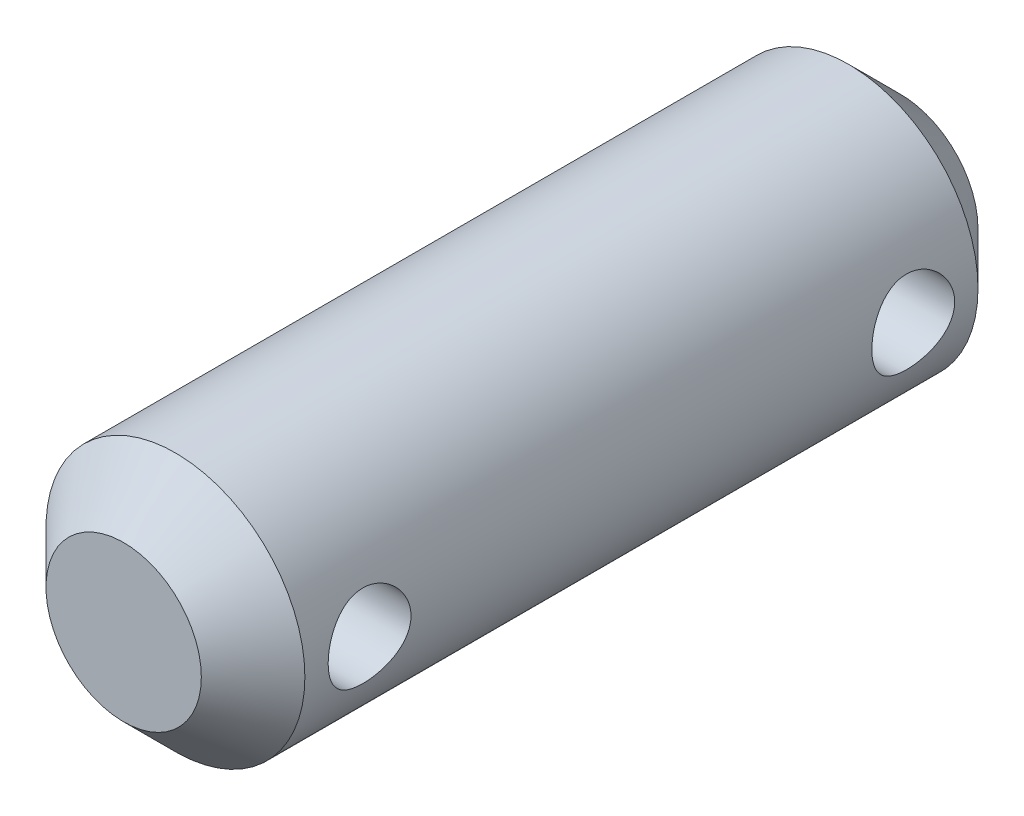
ISO-10303-21;
HEADER;
FILE_DESCRIPTION(('STEP AP214'),'2;1');
FILE_NAME('part.step','',(''),(''),'','','');
FILE_SCHEMA(('AUTOMOTIVE_DESIGN { 1 0 10303 214 1 1 1 1 }'));
ENDSEC;
DATA;
#1=APPLICATION_CONTEXT('core data for automotive mechanical design processes');
#2=APPLICATION_PROTOCOL_DEFINITION('international standard','automotive_design',2000,#1);
#3=PRODUCT_CONTEXT('',#1,'mechanical');
#4=PRODUCT('Part','Part','',(#3));
#5=PRODUCT_RELATED_PRODUCT_CATEGORY('part','',(#4));
#6=PRODUCT_DEFINITION_FORMATION('','',#4);
#7=PRODUCT_DEFINITION_CONTEXT('part definition',#1,'design');
#8=PRODUCT_DEFINITION('design','',#6,#7);
#9=PRODUCT_DEFINITION_SHAPE('','',#8);
#10=(LENGTH_UNIT() NAMED_UNIT(*) SI_UNIT(.MILLI.,.METRE.));
#11=(NAMED_UNIT(*) PLANE_ANGLE_UNIT() SI_UNIT($,.RADIAN.));
#12=(NAMED_UNIT(*) SI_UNIT($,.STERADIAN.) SOLID_ANGLE_UNIT());
#13=UNCERTAINTY_MEASURE_WITH_UNIT(LENGTH_MEASURE(1.E-05),#10,'distance_accuracy_value','');
#14=(GEOMETRIC_REPRESENTATION_CONTEXT(3) GLOBAL_UNCERTAINTY_ASSIGNED_CONTEXT((#13)) GLOBAL_UNIT_ASSIGNED_CONTEXT((#10,
#11,#12)) REPRESENTATION_CONTEXT('',''));
#15=CARTESIAN_POINT('',(0.,0.,0.));
#16=DIRECTION('',(0.,0.,1.));
#17=DIRECTION('',(1.,0.,0.));
#18=AXIS2_PLACEMENT_3D('',#15,#16,#17);
#19=CARTESIAN_POINT('',(0.,0.,30.));
#20=DIRECTION('',(0.,0.,-1.));
#21=DIRECTION('',(-1.,0.,0.));
#22=AXIS2_PLACEMENT_3D('',#19,#20,#21);
#23=CYLINDRICAL_SURFACE('',#22,5.);
#24=CARTESIAN_POINT('',(-5.,0.,6.1));
#25=CARTESIAN_POINT('',(-4.99999978543627,-0.0874958063159797,6.09999975634942));
#26=CARTESIAN_POINT('',(-4.99768184156355,-0.174994637059061,6.09279940472075));
#27=CARTESIAN_POINT('',(-4.98866262172227,-0.347426901237482,6.06426818047074));
#28=CARTESIAN_POINT('',(-4.98196054553558,-0.432359863373708,6.04293472818209));
#29=CARTESIAN_POINT('',(-4.96490383635409,-0.597149225791564,5.98693507878823));
#30=CARTESIAN_POINT('',(-4.95455502045191,-0.677013473384594,5.9522901076294));
#31=CARTESIAN_POINT('',(-4.93126901642872,-0.829798762851157,5.87074316991274));
#32=CARTESIAN_POINT('',(-4.91833138300386,-0.902718607024945,5.82383909423439));
#33=CARTESIAN_POINT('',(-4.89077067933825,-1.04189475779498,5.71751588649597));
#34=CARTESIAN_POINT('',(-4.87610957732918,-1.1078960922464,5.65777290104658));
#35=CARTESIAN_POINT('',(-4.8469706570307,-1.22913423693228,5.52815693345259));
#36=CARTESIAN_POINT('',(-4.83249287552328,-1.28436891793797,5.45828195234513));
#37=CARTESIAN_POINT('',(-4.80494810799029,-1.38391395073831,5.30814714548961));
#38=CARTESIAN_POINT('',(-4.79192785635417,-1.42790123109944,5.22766371872946));
#39=CARTESIAN_POINT('',(-4.76934657798645,-1.5016091713459,5.05995765622989));
#40=CARTESIAN_POINT('',(-4.75978458968016,-1.53133379773326,4.9727369020117));
#41=CARTESIAN_POINT('',(-4.74560122760597,-1.57473134311321,4.79691739272712));
#42=CARTESIAN_POINT('',(-4.74083414932744,-1.58887896846386,4.70844789824797));
#43=CARTESIAN_POINT('',(-4.73634831045,-1.60220433058851,4.53027240081555));
#44=CARTESIAN_POINT('',(-4.73662813227306,-1.6013862709372,4.44056675214803));
#45=CARTESIAN_POINT('',(-4.74207619100075,-1.58517380736381,4.26643441511176));
#46=CARTESIAN_POINT('',(-4.7470401743042,-1.57038842132725,4.1819435465553));
#47=CARTESIAN_POINT('',(-4.76096457446162,-1.52765058974139,4.01671115557794));
#48=CARTESIAN_POINT('',(-4.76992543490025,-1.49969668269327,3.9359700504148));
#49=CARTESIAN_POINT('',(-4.7909865416364,-1.43099645158812,3.77910214117426));
#50=CARTESIAN_POINT('',(-4.80313229469362,-1.39006273103723,3.70306378004853));
#51=CARTESIAN_POINT('',(-4.82917444861168,-1.29669494334068,3.55873795697324));
#52=CARTESIAN_POINT('',(-4.8430713221454,-1.24425776827155,3.49045259725646));
#53=CARTESIAN_POINT('',(-4.87186372141871,-1.12640551540387,3.36013532713372));
#54=CARTESIAN_POINT('',(-4.8867752080818,-1.06048936249403,3.29855922306119));
#55=CARTESIAN_POINT('',(-4.91533168114877,-0.919081432217151,3.18722132176635));
#56=CARTESIAN_POINT('',(-4.92897656433707,-0.843588875652696,3.13746048685711));
#57=CARTESIAN_POINT('',(-4.95361789744584,-0.684261580712376,3.05083655671978));
#58=CARTESIAN_POINT('',(-4.96459080547942,-0.600361279440637,3.01408689916357));
#59=CARTESIAN_POINT('',(-4.98248161100196,-0.427135850361132,2.95536040333729));
#60=CARTESIAN_POINT('',(-4.98940080204637,-0.33781246313155,2.93337885218328));
#61=CARTESIAN_POINT('',(-4.99819424239134,-0.16014178958932,2.90559993333479));
#62=CARTESIAN_POINT('',(-5.00026060178154,-0.0719002860170756,2.8991859263889));
#63=CARTESIAN_POINT('',(-4.99968655318444,0.104410269588104,2.9009792182213));
#64=CARTESIAN_POINT('',(-4.99704687004206,0.192479346087438,2.90918426530988));
#65=CARTESIAN_POINT('',(-4.98748380317497,0.363535018203811,2.93949011308117));
#66=CARTESIAN_POINT('',(-4.98067486649266,0.446594362478022,2.9612199100859));
#67=CARTESIAN_POINT('',(-4.96357585995348,0.607861654600581,3.01750179939625));
#68=CARTESIAN_POINT('',(-4.95328535439546,0.686068993794123,3.05205549660218));
#69=CARTESIAN_POINT('',(-4.92995531019905,0.837596923870444,3.13397101717815));
#70=CARTESIAN_POINT('',(-4.9168532627009,0.910745620500965,3.1816325119423));
#71=CARTESIAN_POINT('',(-4.8893940824048,1.04821150300662,3.28805387298564));
#72=CARTESIAN_POINT('',(-4.87503659432078,1.11252617555398,3.3468168864583));
#73=CARTESIAN_POINT('',(-4.84592967283237,1.23328321488635,3.47667415961096));
#74=CARTESIAN_POINT('',(-4.83118884166735,1.2892857947562,3.54818026768848));
#75=CARTESIAN_POINT('',(-4.80360443110145,1.38854141992569,3.69989467445821));
#76=CARTESIAN_POINT('',(-4.79076083607138,1.43179457025641,3.78010290145405));
#77=CARTESIAN_POINT('',(-4.76856262886575,1.50407580301231,3.94684357865608));
#78=CARTESIAN_POINT('',(-4.75919656820051,1.53315066307446,4.03335413498969));
#79=CARTESIAN_POINT('',(-4.74511281699328,1.57620668246201,4.21040720981033));
#80=CARTESIAN_POINT('',(-4.74039324536734,1.59019395006567,4.30094808113599));
#81=CARTESIAN_POINT('',(-4.73633927898768,1.60222535311566,4.47887596916399));
#82=CARTESIAN_POINT('',(-4.73676019091382,1.60099388446006,4.56620901132899));
#83=CARTESIAN_POINT('',(-4.74234159093745,1.5843835514937,4.7393570054347));
#84=CARTESIAN_POINT('',(-4.74750183734632,1.56900540861121,4.82517203456103));
#85=CARTESIAN_POINT('',(-4.76180543144416,1.52503332416461,4.99148342537688));
#86=CARTESIAN_POINT('',(-4.77088327236763,1.49665627942706,5.07204319889287));
#87=CARTESIAN_POINT('',(-4.79197975594362,1.42766427484382,5.22732176040081));
#88=CARTESIAN_POINT('',(-4.8039990169992,1.38704674114626,5.3020393157627));
#89=CARTESIAN_POINT('',(-4.83023494368376,1.29279266707432,5.44680962981441));
#90=CARTESIAN_POINT('',(-4.8445211905268,1.23869308431578,5.51654826273404));
#91=CARTESIAN_POINT('',(-4.87337180847353,1.11981399792884,5.64619174582096));
#92=CARTESIAN_POINT('',(-4.88793625446695,1.05503158166823,5.70609390519865));
#93=CARTESIAN_POINT('',(-4.91631108200117,0.913912210298352,5.81645828592383));
#94=CARTESIAN_POINT('',(-4.93007751880385,0.837251351760781,5.8665189518843));
#95=CARTESIAN_POINT('',(-4.9547378769786,0.676163529926938,5.95298018809723));
#96=CARTESIAN_POINT('',(-4.96563279071293,0.591739263208158,5.98938547932079));
#97=CARTESIAN_POINT('',(-4.98268341064065,0.423663431644845,6.04524777983044));
#98=CARTESIAN_POINT('',(-4.9891190130145,0.340376766487331,6.06571845058311));
#99=CARTESIAN_POINT('',(-4.99777693541394,0.17139400107612,6.09309314290401));
#100=CARTESIAN_POINT('',(-5.00000021015613,0.0856984512613952,6.10000023864547));
#101=CARTESIAN_POINT('',(-5.,0.,6.1));
#102=B_SPLINE_CURVE_WITH_KNOTS('',3,(#24,#25,#26,#27,#28,#29,#30,#31,#32,#33,#34,#35,#36,#37,
#38,#39,#40,#41,#42,#43,#44,#45,#46,#47,#48,#49,#50,#51,#52,#53,#54,#55,#56,#57,#58,#59,#60,#61,
#62,#63,#64,#65,#66,#67,#68,#69,#70,#71,#72,#73,#74,#75,#76,#77,#78,#79,#80,#81,#82,#83,#84,#85,
#86,#87,#88,#89,#90,#91,#92,#93,#94,#95,#96,#97,#98,#99,#100,#101),.UNSPECIFIED.,.T.,.F.,(4,2,2,
2,2,2,2,2,2,2,2,2,2,2,2,2,2,2,2,2,2,2,2,2,2,2,2,2,2,2,2,2,2,2,2,2,2,2,4),(0.,0.262172289866487,
0.524392446348364,0.786196202111711,1.04804502964703,1.31749718151567,1.58700256668426,
1.86354828826627,2.14001705671955,2.40780489999506,2.67551752794223,2.93207089351445,
3.18865273918778,3.44912195934763,3.70966163813009,3.98267284808623,4.25570628624555,
4.53106471334194,4.80633522466348,5.07051010591344,5.33464430132699,5.59183416387789,
5.84905622438333,6.11273355055081,6.37648573964818,6.6512299305306,6.92597185797942,
7.19980110675104,7.47351945288796,7.73426134972847,7.99498995042988,8.25151822881316,
8.50810048600705,8.77513756675922,9.04224757485583,9.31866285531259,9.5949824844973,
9.85182740305347,10.1086141011961),.UNSPECIFIED.);
#103=CARTESIAN_POINT('',(-5.,0.,6.1));
#104=VERTEX_POINT('',#103);
#105=EDGE_CURVE('E38',#104,#104,#102,.T.);
#106=ORIENTED_EDGE('',*,*,#105,.T.);
#107=EDGE_LOOP('',(#106));
#108=FACE_BOUND('',#107,.T.);
#109=CARTESIAN_POINT('',(4.7370877129308,1.6,4.5));
#110=CARTESIAN_POINT('',(4.73708798780949,1.59999974373874,4.41263376201709));
#111=CARTESIAN_POINT('',(4.73953109593307,1.59281993166463,4.3252644962471));
#112=CARTESIAN_POINT('',(4.7489937190314,1.56437769172508,4.15310041237817));
#113=CARTESIAN_POINT('',(4.75601429573487,1.54311199666736,4.06830619633013));
#114=CARTESIAN_POINT('',(4.77375701461625,1.48731021882536,3.90381189835967));
#115=CARTESIAN_POINT('',(4.78447235673699,1.45279850166911,3.82410277469806));
#116=CARTESIAN_POINT('',(4.80838765550231,1.37156634454408,3.67158235897785));
#117=CARTESIAN_POINT('',(4.82158809072754,1.32484355228541,3.59877239963129));
#118=CARTESIAN_POINT('',(4.84951968764674,1.21871241953147,3.4594936048683));
#119=CARTESIAN_POINT('',(4.86428678030524,1.15893934729319,3.39330983452526));
#120=CARTESIAN_POINT('',(4.89338280213669,1.02918412233017,3.27171357413611));
#121=CARTESIAN_POINT('',(4.90771166672489,0.959200473487309,3.21630266537781));
#122=CARTESIAN_POINT('',(4.93472953085556,0.808949422462772,3.11655461470001));
#123=CARTESIAN_POINT('',(4.94737131144711,0.728476687860993,3.07251285069074));
#124=CARTESIAN_POINT('',(4.96916970645467,0.560792193508548,2.99870143603437));
#125=CARTESIAN_POINT('',(4.97832718206453,0.473582105406685,2.96892825823732));
#126=CARTESIAN_POINT('',(4.99187078015161,0.297884710119076,2.92545622077165));
#127=CARTESIAN_POINT('',(4.99640130994181,0.209529388874191,2.91126974233839));
#128=CARTESIAN_POINT('',(5.00069148119392,0.0315841299204923,2.89782689449889));
#129=CARTESIAN_POINT('',(5.00045225829628,-0.0580055088308475,2.89856697119821));
#130=CARTESIAN_POINT('',(4.9953294799159,-0.232437491666959,2.91463950197237));
#131=CARTESIAN_POINT('',(4.99061428137964,-0.317334316303528,2.92944299784062));
#132=CARTESIAN_POINT('',(4.97727793973528,-0.483368293649631,2.97235182324115));
#133=CARTESIAN_POINT('',(4.96865653796686,-0.564505196993056,3.00045803365593));
#134=CARTESIAN_POINT('',(4.94825462002066,-0.721913949614886,3.06950323251782));
#135=CARTESIAN_POINT('',(4.93643573330445,-0.798111771873499,3.11059918159356));
#136=CARTESIAN_POINT('',(4.9108788342044,-0.94269143741114,3.20433020689855));
#137=CARTESIAN_POINT('',(4.89714031917112,-1.01107122500451,3.25696830747062));
#138=CARTESIAN_POINT('',(4.86849469180912,-1.14122552524351,3.37498764173319));
#139=CARTESIAN_POINT('',(4.85356274482591,-1.2025821378014,3.44082436305752));
#140=CARTESIAN_POINT('',(4.8247258395209,-1.31351207358059,3.5819882609796));
#141=CARTESIAN_POINT('',(4.81082101488724,-1.36308386476991,3.65731666955544));
#142=CARTESIAN_POINT('',(4.78548357380621,-1.44955524382539,3.81655674029328));
#143=CARTESIAN_POINT('',(4.77408325840667,-1.48629250439436,3.90056207537525));
#144=CARTESIAN_POINT('',(4.75542251488665,-1.54496461752815,4.07402080639224));
#145=CARTESIAN_POINT('',(4.74816051319963,-1.56690509705448,4.16347211719119));
#146=CARTESIAN_POINT('',(4.73895031775712,-1.59453893191269,4.34126391009053));
#147=CARTESIAN_POINT('',(4.73679204354283,-1.60087507754216,4.42949364832457));
#148=CARTESIAN_POINT('',(4.73744898777772,-1.59893067907134,4.60576427053874));
#149=CARTESIAN_POINT('',(4.74026339139206,-1.5906525297045,4.6938051830935));
#150=CARTESIAN_POINT('',(4.7503404414304,-1.56029013344713,4.86437702734367));
#151=CARTESIAN_POINT('',(4.75746344492905,-1.53863886571376,4.94699414669862));
#152=CARTESIAN_POINT('',(4.77520515081816,-1.48265712290061,5.10741115974012));
#153=CARTESIAN_POINT('',(4.78582444131636,-1.44832451458384,5.18521024037054));
#154=CARTESIAN_POINT('',(4.80975442366493,-1.3667895840503,5.33634784716175));
#155=CARTESIAN_POINT('',(4.8231358439457,-1.31923446955668,5.4094845588093));
#156=CARTESIAN_POINT('',(4.85093919332853,-1.2130119976528,5.5469734221838));
#157=CARTESIAN_POINT('',(4.86536140505509,-1.15434161483455,5.61132317400831));
#158=CARTESIAN_POINT('',(4.89438512522789,-1.02450097804918,5.7323191106342));
#159=CARTESIAN_POINT('',(4.90896684906861,-0.95289599149004,5.78850480158372));
#160=CARTESIAN_POINT('',(4.93603865529218,-0.800918884886267,5.88808507727672));
#161=CARTESIAN_POINT('',(4.94852882696537,-0.720547139344916,5.93148020812148));
#162=CARTESIAN_POINT('',(4.96994289161967,-0.553783760904259,6.00383599726771));
#163=CARTESIAN_POINT('',(4.97889176140864,-0.467439525556668,6.03289811841377));
#164=CARTESIAN_POINT('',(4.9923242466308,-0.2907499828252,6.07598410411073));
#165=CARTESIAN_POINT('',(4.99680933438748,-0.200406004983305,6.0900129273269));
#166=CARTESIAN_POINT('',(5.00070652519304,-0.0225106351625028,6.10221570789975));
#167=CARTESIAN_POINT('',(5.00033097908978,0.0649911044944412,6.10105331502989));
#168=CARTESIAN_POINT('',(4.99506275597098,0.238495437910281,6.08452291522177));
#169=CARTESIAN_POINT('',(4.99017039818283,0.324498137176769,6.06915591219964));
#170=CARTESIAN_POINT('',(4.97648934157747,0.491403041592259,6.02508172923404));
#171=CARTESIAN_POINT('',(4.96775477499445,0.572358868573167,5.99655962755433));
#172=CARTESIAN_POINT('',(4.9472892397229,0.728372537104163,5.92715339042773));
#173=CARTESIAN_POINT('',(4.93555774588146,0.803429341948621,5.88626708816543));
#174=CARTESIAN_POINT('',(4.90980554197593,0.948377856654681,5.79163889221453));
#175=CARTESIAN_POINT('',(4.89571902538267,1.01799645273276,5.73749676379537));
#176=CARTESIAN_POINT('',(4.86702383992102,1.14737920780259,5.61859072415985));
#177=CARTESIAN_POINT('',(4.85241501223218,1.20714033786284,5.55382356030674));
#178=CARTESIAN_POINT('',(4.82371532498013,1.31724196523931,5.41277335436299));
#179=CARTESIAN_POINT('',(4.80966084431258,1.36717640898326,5.33616499792532));
#180=CARTESIAN_POINT('',(4.78430967821654,1.45341388681981,5.17521529433033));
#181=CARTESIAN_POINT('',(4.77301201309666,1.48972176586894,5.09087670896938));
#182=CARTESIAN_POINT('',(4.75525868307298,1.5454160638658,4.92301715888516));
#183=CARTESIAN_POINT('',(4.74851573857385,1.56582251059464,4.83986484408344));
#184=CARTESIAN_POINT('',(4.73943073150288,1.59311272174624,4.67114220114767));
#185=CARTESIAN_POINT('',(4.73708744369556,1.60000025100005,4.58557255294307));
#186=CARTESIAN_POINT('',(4.7370877129308,1.6,4.5));
#187=B_SPLINE_CURVE_WITH_KNOTS('',3,(#109,#110,#111,#112,#113,#114,#115,#116,#117,#118,#119,
#120,#121,#122,#123,#124,#125,#126,#127,#128,#129,#130,#131,#132,#133,#134,#135,#136,#137,#138,
#139,#140,#141,#142,#143,#144,#145,#146,#147,#148,#149,#150,#151,#152,#153,#154,#155,#156,#157,
#158,#159,#160,#161,#162,#163,#164,#165,#166,#167,#168,#169,#170,#171,#172,#173,#174,#175,#176,
#177,#178,#179,#180,#181,#182,#183,#184,#185,#186),.UNSPECIFIED.,.T.,.F.,(4,2,2,2,2,2,2,2,2,2,2,
2,2,2,2,2,2,2,2,2,2,2,2,2,2,2,2,2,2,2,2,2,2,2,2,2,2,2,4),(0.,0.261782337086142,
0.523625415332401,0.784989132393396,1.04640323461352,1.31636217216967,1.58636070561341,
1.86279377491072,2.13915847552485,2.4066067441957,2.67399133630597,2.93170127402817,
3.18942827924008,3.45039690075846,3.71143398470616,3.98385068324257,4.25630277672778,
4.53208561817767,4.80776352492637,5.07187991332532,5.33595302699623,5.59189456344124,
5.84787917362796,6.1114865329221,6.37516574550518,6.65038672388641,6.92559594982595,
7.19882796886114,7.47196983578453,7.73322052820115,7.99445275803873,8.25211685877031,
8.50982614110575,8.77656491371796,9.04338549583878,9.3196060101,9.59572822026814,
9.85220743369916,10.1086152110862),.UNSPECIFIED.);
#188=CARTESIAN_POINT('',(4.7370877129308,1.6,4.5));
#189=VERTEX_POINT('',#188);
#190=EDGE_CURVE('E42',#189,#189,#187,.T.);
#191=ORIENTED_EDGE('',*,*,#190,.T.);
#192=EDGE_LOOP('',(#191));
#193=FACE_BOUND('',#192,.T.);
#194=CARTESIAN_POINT('',(0.,0.,2.00000000000004));
#195=DIRECTION('',(0.,0.,1.));
#196=DIRECTION('',(1.,0.,0.));
#197=AXIS2_PLACEMENT_3D('',#194,#195,#196);
#198=CIRCLE('',#197,5.);
#199=CARTESIAN_POINT('',(5.,0.,2.00000000000004));
#200=VERTEX_POINT('',#199);
#201=EDGE_CURVE('E72',#200,#200,#198,.T.);
#202=ORIENTED_EDGE('',*,*,#201,.T.);
#203=EDGE_LOOP('',(#202));
#204=FACE_BOUND('',#203,.T.);
#205=CARTESIAN_POINT('',(0.,0.,28.));
#206=DIRECTION('',(0.,0.,1.));
#207=DIRECTION('',(1.,0.,0.));
#208=AXIS2_PLACEMENT_3D('',#205,#206,#207);
#209=CIRCLE('',#208,5.);
#210=CARTESIAN_POINT('',(5.,0.,28.));
#211=VERTEX_POINT('',#210);
#212=EDGE_CURVE('E75',#211,#211,#209,.F.);
#213=ORIENTED_EDGE('',*,*,#212,.T.);
#214=EDGE_LOOP('',(#213));
#215=FACE_BOUND('',#214,.T.);
#216=CARTESIAN_POINT('',(4.7370877129308,1.6,25.5));
#217=CARTESIAN_POINT('',(4.73708798780949,1.59999974373874,25.5873662379829));
#218=CARTESIAN_POINT('',(4.73953109593307,1.59281993166463,25.6747355037529));
#219=CARTESIAN_POINT('',(4.7489937190314,1.56437769172508,25.8468995876219));
#220=CARTESIAN_POINT('',(4.75601429573487,1.54311199666736,25.9316938036699));
#221=CARTESIAN_POINT('',(4.77375701461625,1.48731021882536,26.0961881016403));
#222=CARTESIAN_POINT('',(4.78447235673699,1.45279850166911,26.175897225302));
#223=CARTESIAN_POINT('',(4.80838765550231,1.37156634454408,26.3284176410222));
#224=CARTESIAN_POINT('',(4.82158809072754,1.32484355228541,26.4012276003687));
#225=CARTESIAN_POINT('',(4.84951968764674,1.21871241953147,26.5405063951317));
#226=CARTESIAN_POINT('',(4.86428678030524,1.15893934729319,26.6066901654748));
#227=CARTESIAN_POINT('',(4.89338280213669,1.02918412233017,26.7282864258639));
#228=CARTESIAN_POINT('',(4.90771166672489,0.959200473487307,26.7836973346222));
#229=CARTESIAN_POINT('',(4.93472953085556,0.80894942246277,26.8834453853));
#230=CARTESIAN_POINT('',(4.94737131144711,0.728476687860991,26.9274871493093));
#231=CARTESIAN_POINT('',(4.96916970645467,0.560792193508547,27.0012985639657));
#232=CARTESIAN_POINT('',(4.97832718206453,0.473582105406684,27.0310717417627));
#233=CARTESIAN_POINT('',(4.99187078015161,0.297884710119075,27.0745437792284));
#234=CARTESIAN_POINT('',(4.99640130994181,0.209529388874191,27.0887302576616));
#235=CARTESIAN_POINT('',(5.00069148119392,0.0315841299204923,27.1021731055011));
#236=CARTESIAN_POINT('',(5.00045225829628,-0.058005508830847,27.1014330288018));
#237=CARTESIAN_POINT('',(4.9953294799159,-0.232437491666958,27.0853604980276));
#238=CARTESIAN_POINT('',(4.99061428137964,-0.317334316303527,27.0705570021594));
#239=CARTESIAN_POINT('',(4.97727793973528,-0.48336829364963,27.0276481767589));
#240=CARTESIAN_POINT('',(4.96865653796686,-0.564505196993056,26.9995419663441));
#241=CARTESIAN_POINT('',(4.94825462002066,-0.721913949614885,26.9304967674822));
#242=CARTESIAN_POINT('',(4.93643573330445,-0.798111771873498,26.8894008184065));
#243=CARTESIAN_POINT('',(4.9108788342044,-0.942691437411139,26.7956697931015));
#244=CARTESIAN_POINT('',(4.89714031917112,-1.01107122500451,26.7430316925294));
#245=CARTESIAN_POINT('',(4.86849469180912,-1.14122552524351,26.6250123582668));
#246=CARTESIAN_POINT('',(4.85356274482591,-1.2025821378014,26.5591756369425));
#247=CARTESIAN_POINT('',(4.8247258395209,-1.31351207358059,26.4180117390204));
#248=CARTESIAN_POINT('',(4.81082101488724,-1.36308386476992,26.3426833304446));
#249=CARTESIAN_POINT('',(4.78548357380621,-1.44955524382539,26.1834432597067));
#250=CARTESIAN_POINT('',(4.77408325840667,-1.48629250439436,26.0994379246248));
#251=CARTESIAN_POINT('',(4.75542251488665,-1.54496461752815,25.9259791936078));
#252=CARTESIAN_POINT('',(4.74816051319963,-1.56690509705448,25.8365278828088));
#253=CARTESIAN_POINT('',(4.73895031775712,-1.59453893191269,25.6587360899095));
#254=CARTESIAN_POINT('',(4.73679204354283,-1.60087507754216,25.5705063516754));
#255=CARTESIAN_POINT('',(4.73744898777772,-1.59893067907134,25.3942357294613));
#256=CARTESIAN_POINT('',(4.74026339139206,-1.5906525297045,25.3061948169065));
#257=CARTESIAN_POINT('',(4.7503404414304,-1.56029013344713,25.1356229726564));
#258=CARTESIAN_POINT('',(4.75746344492905,-1.53863886571376,25.0530058533014));
#259=CARTESIAN_POINT('',(4.77520515081816,-1.48265712290061,24.8925888402599));
#260=CARTESIAN_POINT('',(4.78582444131636,-1.44832451458384,24.8147897596295));
#261=CARTESIAN_POINT('',(4.80975442366493,-1.3667895840503,24.6636521528383));
#262=CARTESIAN_POINT('',(4.8231358439457,-1.31923446955668,24.5905154411907));
#263=CARTESIAN_POINT('',(4.85093919332853,-1.2130119976528,24.4530265778162));
#264=CARTESIAN_POINT('',(4.86536140505509,-1.15434161483454,24.3886768259917));
#265=CARTESIAN_POINT('',(4.89438512522789,-1.02450097804918,24.2676808893658));
#266=CARTESIAN_POINT('',(4.90896684906861,-0.952895991490039,24.2114951984163));
#267=CARTESIAN_POINT('',(4.93603865529218,-0.800918884886267,24.1119149227233));
#268=CARTESIAN_POINT('',(4.94852882696537,-0.720547139344915,24.0685197918785));
#269=CARTESIAN_POINT('',(4.96994289161967,-0.553783760904258,23.9961640027323));
#270=CARTESIAN_POINT('',(4.97889176140864,-0.467439525556667,23.9671018815862));
#271=CARTESIAN_POINT('',(4.9923242466308,-0.290749982825201,23.9240158958893));
#272=CARTESIAN_POINT('',(4.99680933438748,-0.200406004983306,23.9099870726731));
#273=CARTESIAN_POINT('',(5.00070652519304,-0.0225106351625048,23.8977842921003));
#274=CARTESIAN_POINT('',(5.00033097908978,0.0649911044944395,23.8989466849701));
#275=CARTESIAN_POINT('',(4.99506275597098,0.238495437910279,23.9154770847783));
#276=CARTESIAN_POINT('',(4.99017039818283,0.324498137176767,23.9308440878004));
#277=CARTESIAN_POINT('',(4.97648934157747,0.491403041592258,23.974918270766));
#278=CARTESIAN_POINT('',(4.96775477499445,0.572358868573166,24.0034403724457));
#279=CARTESIAN_POINT('',(4.9472892397229,0.728372537104163,24.0728466095723));
#280=CARTESIAN_POINT('',(4.93555774588146,0.80342934194862,24.1137329118346));
#281=CARTESIAN_POINT('',(4.90980554197593,0.94837785665468,24.2083611077855));
#282=CARTESIAN_POINT('',(4.89571902538267,1.01799645273276,24.2625032362047));
#283=CARTESIAN_POINT('',(4.86702383992102,1.14737920780259,24.3814092758402));
#284=CARTESIAN_POINT('',(4.85241501223218,1.20714033786284,24.4461764396933));
#285=CARTESIAN_POINT('',(4.82371532498013,1.31724196523931,24.587226645637));
#286=CARTESIAN_POINT('',(4.80966084431258,1.36717640898326,24.6638350020747));
#287=CARTESIAN_POINT('',(4.78430967821654,1.45341388681981,24.8247847056697));
#288=CARTESIAN_POINT('',(4.77301201309667,1.48972176586893,24.9091232910306));
#289=CARTESIAN_POINT('',(4.75525868307298,1.5454160638658,25.0769828411149));
#290=CARTESIAN_POINT('',(4.74851573857385,1.56582251059464,25.1601351559166));
#291=CARTESIAN_POINT('',(4.73943073150288,1.59311272174624,25.3288577988524));
#292=CARTESIAN_POINT('',(4.73708744369556,1.60000025100005,25.4144274470569));
#293=CARTESIAN_POINT('',(4.7370877129308,1.6,25.5));
#294=B_SPLINE_CURVE_WITH_KNOTS('',3,(#216,#217,#218,#219,#220,#221,#222,#223,#224,#225,#226,
#227,#228,#229,#230,#231,#232,#233,#234,#235,#236,#237,#238,#239,#240,#241,#242,#243,#244,#245,
#246,#247,#248,#249,#250,#251,#252,#253,#254,#255,#256,#257,#258,#259,#260,#261,#262,#263,#264,
#265,#266,#267,#268,#269,#270,#271,#272,#273,#274,#275,#276,#277,#278,#279,#280,#281,#282,#283,
#284,#285,#286,#287,#288,#289,#290,#291,#292,#293),.UNSPECIFIED.,.T.,.F.,(4,2,2,2,2,2,2,2,2,2,2,
2,2,2,2,2,2,2,2,2,2,2,2,2,2,2,2,2,2,2,2,2,2,2,2,2,2,2,4),(0.,0.261782337086144,0.5236254153324,
0.784989132393395,1.04640323461352,1.31636217216967,1.58636070561341,1.86279377491073,
2.13915847552485,2.4066067441957,2.67399133630597,2.93170127402817,3.18942827924008,
3.45039690075846,3.71143398470616,3.98385068324257,4.25630277672778,4.53208561817766,
4.80776352492637,5.07187991332532,5.33595302699622,5.59189456344124,5.84787917362796,
6.1114865329221,6.37516574550518,6.65038672388641,6.92559594982595,7.19882796886114,
7.47196983578453,7.73322052820115,7.99445275803872,8.25211685877031,8.50982614110574,
8.77656491371796,9.04338549583878,9.3196060101,9.59572822026813,9.85220743369916,
10.1086152110862),.UNSPECIFIED.);
#295=CARTESIAN_POINT('',(4.7370877129308,1.6,25.5));
#296=VERTEX_POINT('',#295);
#297=EDGE_CURVE('E34',#296,#296,#294,.T.);
#298=ORIENTED_EDGE('',*,*,#297,.F.);
#299=EDGE_LOOP('',(#298));
#300=FACE_BOUND('',#299,.T.);
#301=CARTESIAN_POINT('',(-5.,0.,27.1));
#302=CARTESIAN_POINT('',(-4.99999978543627,0.0874958063159797,27.0999997563494));
#303=CARTESIAN_POINT('',(-4.99768184156355,0.174994637059061,27.0927994047208));
#304=CARTESIAN_POINT('',(-4.98866262172227,0.347426901237482,27.0642681804708));
#305=CARTESIAN_POINT('',(-4.98196054553558,0.432359863373708,27.0429347281821));
#306=CARTESIAN_POINT('',(-4.96490383635409,0.597149225791565,26.9869350787882));
#307=CARTESIAN_POINT('',(-4.95455502045191,0.677013473384596,26.9522901076294));
#308=CARTESIAN_POINT('',(-4.93126901642872,0.829798762851158,26.8707431699128));
#309=CARTESIAN_POINT('',(-4.91833138300386,0.902718607024946,26.8238390942344));
#310=CARTESIAN_POINT('',(-4.89077067933825,1.04189475779498,26.717515886496));
#311=CARTESIAN_POINT('',(-4.87610957732918,1.1078960922464,26.6577729010466));
#312=CARTESIAN_POINT('',(-4.8469706570307,1.22913423693228,26.5281569334526));
#313=CARTESIAN_POINT('',(-4.83249287552328,1.28436891793797,26.4582819523451));
#314=CARTESIAN_POINT('',(-4.80494810799029,1.38391395073831,26.3081471454896));
#315=CARTESIAN_POINT('',(-4.79192785635417,1.42790123109944,26.2276637187295));
#316=CARTESIAN_POINT('',(-4.76934657798646,1.5016091713459,26.0599576562299));
#317=CARTESIAN_POINT('',(-4.75978458968016,1.53133379773326,25.9727369020117));
#318=CARTESIAN_POINT('',(-4.74560122760597,1.57473134311321,25.7969173927271));
#319=CARTESIAN_POINT('',(-4.74083414932744,1.58887896846385,25.708447898248));
#320=CARTESIAN_POINT('',(-4.73634831045,1.6022043305885,25.5302724008156));
#321=CARTESIAN_POINT('',(-4.73662813227306,1.6013862709372,25.440566752148));
#322=CARTESIAN_POINT('',(-4.74207619100075,1.58517380736381,25.2664344151118));
#323=CARTESIAN_POINT('',(-4.7470401743042,1.57038842132725,25.1819435465553));
#324=CARTESIAN_POINT('',(-4.76096457446162,1.52765058974139,25.016711155578));
#325=CARTESIAN_POINT('',(-4.76992543490025,1.49969668269327,24.9359700504148));
#326=CARTESIAN_POINT('',(-4.7909865416364,1.43099645158812,24.7791021411743));
#327=CARTESIAN_POINT('',(-4.80313229469362,1.39006273103722,24.7030637800485));
#328=CARTESIAN_POINT('',(-4.82917444861168,1.29669494334067,24.5587379569732));
#329=CARTESIAN_POINT('',(-4.8430713221454,1.24425776827155,24.4904525972565));
#330=CARTESIAN_POINT('',(-4.87186372141871,1.12640551540387,24.3601353271337));
#331=CARTESIAN_POINT('',(-4.8867752080818,1.06048936249402,24.2985592230612));
#332=CARTESIAN_POINT('',(-4.91533168114877,0.919081432217148,24.1872213217664));
#333=CARTESIAN_POINT('',(-4.92897656433707,0.843588875652693,24.1374604868571));
#334=CARTESIAN_POINT('',(-4.95361789744584,0.684261580712373,24.0508365567198));
#335=CARTESIAN_POINT('',(-4.96459080547942,0.600361279440633,24.0140868991636));
#336=CARTESIAN_POINT('',(-4.98248161100196,0.427135850361128,23.9553604033373));
#337=CARTESIAN_POINT('',(-4.98940080204637,0.337812463131546,23.9333788521833));
#338=CARTESIAN_POINT('',(-4.99819424239135,0.160141789589316,23.9055999333348));
#339=CARTESIAN_POINT('',(-5.00026060178154,0.0719002860170721,23.8991859263889));
#340=CARTESIAN_POINT('',(-4.99968655318444,-0.104410269588107,23.9009792182213));
#341=CARTESIAN_POINT('',(-4.99704687004206,-0.192479346087441,23.9091842653099));
#342=CARTESIAN_POINT('',(-4.98748380317497,-0.363535018203814,23.9394901130812));
#343=CARTESIAN_POINT('',(-4.98067486649266,-0.446594362478025,23.9612199100859));
#344=CARTESIAN_POINT('',(-4.96357585995349,-0.607861654600584,24.0175017993963));
#345=CARTESIAN_POINT('',(-4.95328535439546,-0.686068993794127,24.0520554966022));
#346=CARTESIAN_POINT('',(-4.92995531019905,-0.837596923870447,24.1339710171782));
#347=CARTESIAN_POINT('',(-4.9168532627009,-0.910745620500969,24.1816325119423));
#348=CARTESIAN_POINT('',(-4.8893940824048,-1.04821150300662,24.2880538729857));
#349=CARTESIAN_POINT('',(-4.87503659432078,-1.11252617555399,24.3468168864583));
#350=CARTESIAN_POINT('',(-4.84592967283237,-1.23328321488635,24.476674159611));
#351=CARTESIAN_POINT('',(-4.83118884166735,-1.2892857947562,24.5481802676885));
#352=CARTESIAN_POINT('',(-4.80360443110145,-1.38854141992569,24.6998946744582));
#353=CARTESIAN_POINT('',(-4.79076083607138,-1.43179457025642,24.7801029014541));
#354=CARTESIAN_POINT('',(-4.76856262886575,-1.50407580301231,24.9468435786561));
#355=CARTESIAN_POINT('',(-4.75919656820051,-1.53315066307446,25.0333541349897));
#356=CARTESIAN_POINT('',(-4.74511281699328,-1.57620668246201,25.2104072098103));
#357=CARTESIAN_POINT('',(-4.74039324536734,-1.59019395006567,25.300948081136));
#358=CARTESIAN_POINT('',(-4.73633927898768,-1.60222535311566,25.478875969164));
#359=CARTESIAN_POINT('',(-4.73676019091382,-1.60099388446006,25.566209011329));
#360=CARTESIAN_POINT('',(-4.74234159093745,-1.5843835514937,25.7393570054347));
#361=CARTESIAN_POINT('',(-4.74750183734632,-1.56900540861121,25.825172034561));
#362=CARTESIAN_POINT('',(-4.76180543144416,-1.52503332416461,25.9914834253769));
#363=CARTESIAN_POINT('',(-4.77088327236763,-1.49665627942706,26.0720431988929));
#364=CARTESIAN_POINT('',(-4.79197975594362,-1.42766427484382,26.2273217604008));
#365=CARTESIAN_POINT('',(-4.8039990169992,-1.38704674114626,26.3020393157627));
#366=CARTESIAN_POINT('',(-4.83023494368376,-1.29279266707432,26.4468096298144));
#367=CARTESIAN_POINT('',(-4.8445211905268,-1.23869308431579,26.5165482627341));
#368=CARTESIAN_POINT('',(-4.87337180847353,-1.11981399792885,26.646191745821));
#369=CARTESIAN_POINT('',(-4.88793625446695,-1.05503158166823,26.7060939051987));
#370=CARTESIAN_POINT('',(-4.91631108200117,-0.913912210298353,26.8164582859239));
#371=CARTESIAN_POINT('',(-4.93007751880385,-0.837251351760782,26.8665189518843));
#372=CARTESIAN_POINT('',(-4.9547378769786,-0.676163529926938,26.9529801880972));
#373=CARTESIAN_POINT('',(-4.96563279071293,-0.591739263208157,26.9893854793208));
#374=CARTESIAN_POINT('',(-4.98268341064065,-0.423663431644844,27.0452477798305));
#375=CARTESIAN_POINT('',(-4.9891190130145,-0.34037676648733,27.0657184505831));
#376=CARTESIAN_POINT('',(-4.99777693541394,-0.171394001076119,27.093093142904));
#377=CARTESIAN_POINT('',(-5.00000021015613,-0.0856984512613945,27.1000002386455));
#378=CARTESIAN_POINT('',(-5.,0.,27.1));
#379=B_SPLINE_CURVE_WITH_KNOTS('',3,(#301,#302,#303,#304,#305,#306,#307,#308,#309,#310,#311,
#312,#313,#314,#315,#316,#317,#318,#319,#320,#321,#322,#323,#324,#325,#326,#327,#328,#329,#330,
#331,#332,#333,#334,#335,#336,#337,#338,#339,#340,#341,#342,#343,#344,#345,#346,#347,#348,#349,
#350,#351,#352,#353,#354,#355,#356,#357,#358,#359,#360,#361,#362,#363,#364,#365,#366,#367,#368,
#369,#370,#371,#372,#373,#374,#375,#376,#377,#378),.UNSPECIFIED.,.T.,.F.,(4,2,2,2,2,2,2,2,2,2,2,
2,2,2,2,2,2,2,2,2,2,2,2,2,2,2,2,2,2,2,2,2,2,2,2,2,2,2,4),(0.,0.262172289866487,
0.524392446348364,0.786196202111711,1.04804502964703,1.31749718151567,1.58700256668426,
1.86354828826627,2.14001705671955,2.40780489999506,2.67551752794223,2.93207089351445,
3.18865273918778,3.44912195934763,3.70966163813009,3.98267284808623,4.25570628624555,
4.53106471334195,4.80633522466349,5.07051010591344,5.33464430132699,5.59183416387789,
5.84905622438333,6.11273355055081,6.37648573964819,6.65122993053059,6.92597185797942,
7.19980110675104,7.47351945288796,7.73426134972846,7.99498995042987,8.25151822881316,
8.50810048600704,8.77513756675922,9.04224757485583,9.3186628553126,9.5949824844973,
9.85182740305348,10.1086141011961),.UNSPECIFIED.);
#380=CARTESIAN_POINT('',(-5.,0.,27.1));
#381=VERTEX_POINT('',#380);
#382=EDGE_CURVE('E10',#381,#381,#379,.T.);
#383=ORIENTED_EDGE('',*,*,#382,.F.);
#384=EDGE_LOOP('',(#383));
#385=FACE_BOUND('',#384,.T.);
#386=ADVANCED_FACE('F24',(#108,#193,#204,#215,#300,#385),#23,.T.);
#387=CARTESIAN_POINT('',(0.,0.,30.));
#388=DIRECTION('',(0.,0.,1.));
#389=DIRECTION('',(1.,0.,0.));
#390=AXIS2_PLACEMENT_3D('',#387,#388,#389);
#391=PLANE('',#390);
#392=CARTESIAN_POINT('',(0.,0.,30.));
#393=DIRECTION('',(0.,0.,1.));
#394=DIRECTION('',(1.,0.,0.));
#395=AXIS2_PLACEMENT_3D('',#392,#393,#394);
#396=CIRCLE('',#395,2.99999999999996);
#397=CARTESIAN_POINT('',(2.99999999999996,0.,30.));
#398=VERTEX_POINT('',#397);
#399=EDGE_CURVE('E66',#398,#398,#396,.T.);
#400=ORIENTED_EDGE('',*,*,#399,.T.);
#401=EDGE_LOOP('',(#400));
#402=FACE_BOUND('',#401,.T.);
#403=ADVANCED_FACE('F86',(#402),#391,.T.);
#404=CARTESIAN_POINT('',(0.,0.,0.));
#405=DIRECTION('',(0.,0.,1.));
#406=DIRECTION('',(1.,0.,0.));
#407=AXIS2_PLACEMENT_3D('',#404,#405,#406);
#408=PLANE('',#407);
#409=CARTESIAN_POINT('',(0.,0.,0.));
#410=DIRECTION('',(0.,0.,1.));
#411=DIRECTION('',(1.,0.,0.));
#412=AXIS2_PLACEMENT_3D('',#409,#410,#411);
#413=CIRCLE('',#412,2.99999999999998);
#414=CARTESIAN_POINT('',(2.99999999999998,0.,0.));
#415=VERTEX_POINT('',#414);
#416=EDGE_CURVE('E69',#415,#415,#413,.F.);
#417=ORIENTED_EDGE('',*,*,#416,.T.);
#418=EDGE_LOOP('',(#417));
#419=FACE_BOUND('',#418,.T.);
#420=ADVANCED_FACE('F88',(#419),#408,.F.);
#421=CARTESIAN_POINT('',(0.,0.,2.00000000000004));
#422=DIRECTION('',(0.,0.,1.));
#423=DIRECTION('',(1.,0.,0.));
#424=AXIS2_PLACEMENT_3D('',#421,#422,#423);
#425=CONICAL_SURFACE('',#424,5.,0.785398163397443);
#426=ORIENTED_EDGE('',*,*,#416,.F.);
#427=EDGE_LOOP('',(#426));
#428=FACE_BOUND('',#427,.T.);
#429=ORIENTED_EDGE('',*,*,#201,.F.);
#430=EDGE_LOOP('',(#429));
#431=FACE_BOUND('',#430,.T.);
#432=ADVANCED_FACE('F83',(#428,#431),#425,.T.);
#433=CARTESIAN_POINT('',(0.,0.,30.));
#434=DIRECTION('',(0.,0.,-1.));
#435=DIRECTION('',(-1.,0.,0.));
#436=AXIS2_PLACEMENT_3D('',#433,#434,#435);
#437=CONICAL_SURFACE('',#436,2.99999999999996,0.785398163397453);
#438=ORIENTED_EDGE('',*,*,#212,.F.);
#439=EDGE_LOOP('',(#438));
#440=FACE_BOUND('',#439,.T.);
#441=ORIENTED_EDGE('',*,*,#399,.F.);
#442=EDGE_LOOP('',(#441));
#443=FACE_BOUND('',#442,.T.);
#444=ADVANCED_FACE('F58',(#440,#443),#437,.T.);
#445=CARTESIAN_POINT('',(-5.,0.,4.5));
#446=DIRECTION('',(1.,0.,0.));
#447=DIRECTION('',(0.,1.,0.));
#448=AXIS2_PLACEMENT_3D('',#445,#446,#447);
#449=CYLINDRICAL_SURFACE('',#448,1.6);
#450=ORIENTED_EDGE('',*,*,#190,.F.);
#451=EDGE_LOOP('',(#450));
#452=FACE_BOUND('',#451,.T.);
#453=ORIENTED_EDGE('',*,*,#105,.F.);
#454=EDGE_LOOP('',(#453));
#455=FACE_BOUND('',#454,.T.);
#456=ADVANCED_FACE('F53',(#452,#455),#449,.F.);
#457=CARTESIAN_POINT('',(-5.,0.,25.5));
#458=DIRECTION('',(1.,0.,0.));
#459=DIRECTION('',(0.,1.,0.));
#460=AXIS2_PLACEMENT_3D('',#457,#458,#459);
#461=CYLINDRICAL_SURFACE('',#460,1.6);
#462=ORIENTED_EDGE('',*,*,#297,.T.);
#463=EDGE_LOOP('',(#462));
#464=FACE_BOUND('',#463,.T.);
#465=ORIENTED_EDGE('',*,*,#382,.T.);
#466=EDGE_LOOP('',(#465));
#467=FACE_BOUND('',#466,.T.);
#468=ADVANCED_FACE('F50',(#464,#467),#461,.F.);
#469=CLOSED_SHELL('',(#386,#403,#420,#432,#444,#456,#468));
#470=MANIFOLD_SOLID_BREP('B2',#469);
#471=ADVANCED_BREP_SHAPE_REPRESENTATION('',(#18,#470),#14);
#472=SHAPE_DEFINITION_REPRESENTATION(#9,#471);
ENDSEC;
END-ISO-10303-21;
